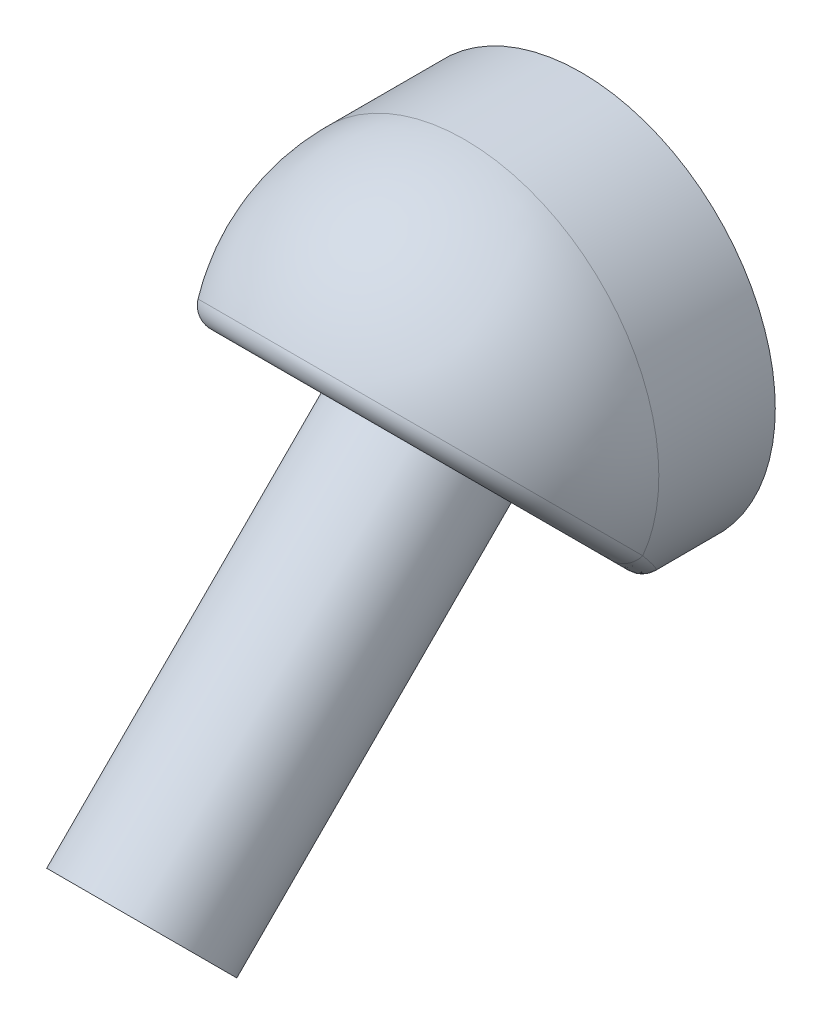
ISO-10303-21;
HEADER;
FILE_DESCRIPTION(('STEP AP214'),'2;1');
FILE_NAME('part.step','',(''),(''),'','','');
FILE_SCHEMA(('AUTOMOTIVE_DESIGN { 1 0 10303 214 1 1 1 1 }'));
ENDSEC;
DATA;
#1=APPLICATION_CONTEXT('core data for automotive mechanical design processes');
#2=APPLICATION_PROTOCOL_DEFINITION('international standard','automotive_design',2000,#1);
#3=PRODUCT_CONTEXT('',#1,'mechanical');
#4=PRODUCT('Part','Part','',(#3));
#5=PRODUCT_RELATED_PRODUCT_CATEGORY('part','',(#4));
#6=PRODUCT_DEFINITION_FORMATION('','',#4);
#7=PRODUCT_DEFINITION_CONTEXT('part definition',#1,'design');
#8=PRODUCT_DEFINITION('design','',#6,#7);
#9=PRODUCT_DEFINITION_SHAPE('','',#8);
#10=(LENGTH_UNIT() NAMED_UNIT(*) SI_UNIT(.MILLI.,.METRE.));
#11=(NAMED_UNIT(*) PLANE_ANGLE_UNIT() SI_UNIT($,.RADIAN.));
#12=(NAMED_UNIT(*) SI_UNIT($,.STERADIAN.) SOLID_ANGLE_UNIT());
#13=UNCERTAINTY_MEASURE_WITH_UNIT(LENGTH_MEASURE(1.E-05),#10,'distance_accuracy_value','');
#14=(GEOMETRIC_REPRESENTATION_CONTEXT(3) GLOBAL_UNCERTAINTY_ASSIGNED_CONTEXT((#13)) GLOBAL_UNIT_ASSIGNED_CONTEXT((#10,
#11,#12)) REPRESENTATION_CONTEXT('',''));
#15=CARTESIAN_POINT('',(0.,0.,0.));
#16=DIRECTION('',(0.,0.,1.));
#17=DIRECTION('',(1.,0.,0.));
#18=AXIS2_PLACEMENT_3D('',#15,#16,#17);
#19=CARTESIAN_POINT('',(0.,-0.549999999999999,0.549999999999997));
#20=DIRECTION('',(0.,-0.707106781186549,0.707106781186546));
#21=DIRECTION('',(0.,-0.707106781186546,-0.707106781186549));
#22=AXIS2_PLACEMENT_3D('',#19,#20,#21);
#23=PLANE('',#22);
#24=CARTESIAN_POINT('',(-3.5,-0.25,0.849999999999999));
#25=DIRECTION('',(0.,-0.707106781186549,0.707106781186546));
#26=DIRECTION('',(0.,-0.707106781186546,-0.707106781186549));
#27=AXIS2_PLACEMENT_3D('',#24,#25,#26);
#28=CIRCLE('',#27,0.4);
#29=CARTESIAN_POINT('',(-3.5,-0.532842712474618,0.567157287525379));
#30=VERTEX_POINT('',#29);
#31=EDGE_CURVE('E89',#30,#30,#28,.T.);
#32=ORIENTED_EDGE('',*,*,#31,.F.);
#33=EDGE_LOOP('',(#32));
#34=FACE_BOUND('',#33,.T.);
#35=CARTESIAN_POINT('',(-3.5,-0.249999999999999,0.849999999999998));
#36=DIRECTION('',(0.,-0.707106781186549,0.707106781186546));
#37=DIRECTION('',(0.,-0.707106781186546,-0.707106781186549));
#38=AXIS2_PLACEMENT_3D('',#35,#36,#37);
#39=CIRCLE('',#38,0.863545411729259);
#40=CARTESIAN_POINT('',(-2.67451750095032,-0.429289321881342,0.670710678118655));
#41=VERTEX_POINT('',#40);
#42=CARTESIAN_POINT('',(-4.32548249904969,-0.429289321881342,0.670710678118655));
#43=VERTEX_POINT('',#42);
#44=EDGE_CURVE('E77',#41,#43,#39,.T.);
#45=ORIENTED_EDGE('',*,*,#44,.T.);
#46=CARTESIAN_POINT('',(-3.5,-0.0707106781186549,1.02928932188134));
#47=DIRECTION('',(0.,-0.707106781186549,0.707106781186546));
#48=DIRECTION('',(0.,-0.707106781186546,-0.707106781186549));
#49=AXIS2_PLACEMENT_3D('',#46,#47,#48);
#50=ELLIPSE('',#49,1.27279220613579,0.9);
#51=EDGE_CURVE('E72',#43,#41,#50,.T.);
#52=ORIENTED_EDGE('',*,*,#51,.T.);
#53=EDGE_LOOP('',(#45,#52));
#54=FACE_BOUND('',#53,.T.);
#55=ADVANCED_FACE('F39',(#34,#54),#23,.T.);
#56=CARTESIAN_POINT('',(-3.5,0.,0.));
#57=DIRECTION('',(0.,0.,1.));
#58=DIRECTION('',(1.,0.,0.));
#59=AXIS2_PLACEMENT_3D('',#56,#57,#58);
#60=PLANE('',#59);
#61=CARTESIAN_POINT('',(-3.5,0.,0.));
#62=DIRECTION('',(0.,0.,1.));
#63=DIRECTION('',(1.,0.,0.));
#64=AXIS2_PLACEMENT_3D('',#61,#62,#63);
#65=CIRCLE('',#64,1.);
#66=CARTESIAN_POINT('',(-2.5,0.,0.));
#67=VERTEX_POINT('',#66);
#68=EDGE_CURVE('E79',#67,#67,#65,.T.);
#69=ORIENTED_EDGE('',*,*,#68,.F.);
#70=EDGE_LOOP('',(#69));
#71=FACE_BOUND('',#70,.T.);
#72=ADVANCED_FACE('F104',(#71),#60,.F.);
#73=CARTESIAN_POINT('',(-3.5,0.,1.6));
#74=DIRECTION('',(0.,0.,-1.));
#75=DIRECTION('',(-1.,0.,0.));
#76=AXIS2_PLACEMENT_3D('',#73,#74,#75);
#77=CYLINDRICAL_SURFACE('',#76,1.);
#78=ORIENTED_EDGE('',*,*,#68,.T.);
#79=EDGE_LOOP('',(#78));
#80=FACE_BOUND('',#79,.T.);
#81=CARTESIAN_POINT('',(-3.5,0.,0.6));
#82=DIRECTION('',(0.,0.,-1.));
#83=DIRECTION('',(-1.,0.,0.));
#84=AXIS2_PLACEMENT_3D('',#81,#82,#83);
#85=CIRCLE('',#84,1.);
#86=CARTESIAN_POINT('',(-4.41720277672187,-0.398420715291875,0.6));
#87=VERTEX_POINT('',#86);
#88=CARTESIAN_POINT('',(-2.58279722327813,-0.398420715291875,0.6));
#89=VERTEX_POINT('',#88);
#90=EDGE_CURVE('E84',#87,#89,#85,.T.);
#91=ORIENTED_EDGE('',*,*,#90,.T.);
#92=CARTESIAN_POINT('',(-3.5,0.,0.958578643762689));
#93=DIRECTION('',(0.,0.668964731622451,-0.743294146247165));
#94=DIRECTION('',(0.,-0.743294146247165,-0.668964731622451));
#95=AXIS2_PLACEMENT_3D('',#92,#93,#94);
#96=ELLIPSE('',#95,1.34536240470737,1.);
#97=EDGE_CURVE('E48',#89,#87,#96,.T.);
#98=ORIENTED_EDGE('',*,*,#97,.T.);
#99=EDGE_LOOP('',(#91,#98));
#100=FACE_BOUND('',#99,.T.);
#101=ADVANCED_FACE('F110',(#80,#100),#77,.T.);
#102=CARTESIAN_POINT('',(-3.5,0.,0.6));
#103=DIRECTION('',(0.,0.,1.));
#104=DIRECTION('',(1.,0.,0.));
#105=AXIS2_PLACEMENT_3D('',#102,#103,#104);
#106=SPHERICAL_SURFACE('',#105,1.);
#107=ORIENTED_EDGE('',*,*,#90,.F.);
#108=CARTESIAN_POINT('',(-3.5,-0.199210357645938,0.799210357645938));
#109=DIRECTION('',(0.,0.707106781186549,-0.707106781186546));
#110=DIRECTION('',(0.,0.707106781186546,0.707106781186549));
#111=AXIS2_PLACEMENT_3D('',#108,#109,#110);
#112=CIRCLE('',#111,0.959494901921399);
#113=EDGE_CURVE('E12',#87,#89,#112,.T.);
#114=ORIENTED_EDGE('',*,*,#113,.T.);
#115=EDGE_LOOP('',(#107,#114));
#116=FACE_BOUND('',#115,.T.);
#117=ADVANCED_FACE('F106',(#116),#106,.T.);
#118=CARTESIAN_POINT('',(-3.5,-0.179289321881344,0.779289321881344));
#119=DIRECTION('',(0.,-0.707106781186549,0.707106781186546));
#120=DIRECTION('',(0.,-0.707106781186546,-0.707106781186549));
#121=AXIS2_PLACEMENT_3D('',#118,#119,#120);
#122=TOROIDAL_SURFACE('',#121,0.863545411729259,0.1);
#123=CARTESIAN_POINT('',(-2.67451750095032,-0.358578643762687,0.6));
#124=DIRECTION('',(-0.293619058302362,-0.675939290395828,-0.675939290395831));
#125=DIRECTION('',(0.,0.707106781186549,-0.707106781186546));
#126=AXIS2_PLACEMENT_3D('',#123,#124,#125);
#127=CIRCLE('',#126,0.1);
#128=EDGE_CURVE('E68',#89,#41,#127,.T.);
#129=ORIENTED_EDGE('',*,*,#128,.F.);
#130=ORIENTED_EDGE('',*,*,#113,.F.);
#131=CARTESIAN_POINT('',(-4.32548249904969,-0.358578643762687,0.6));
#132=DIRECTION('',(0.293619058302364,-0.675939290395827,-0.67593929039583));
#133=DIRECTION('',(0.,0.707106781186549,-0.707106781186546));
#134=AXIS2_PLACEMENT_3D('',#131,#132,#133);
#135=CIRCLE('',#134,0.1);
#136=EDGE_CURVE('E61',#43,#87,#135,.T.);
#137=ORIENTED_EDGE('',*,*,#136,.F.);
#138=ORIENTED_EDGE('',*,*,#44,.F.);
#139=EDGE_LOOP('',(#129,#130,#137,#138));
#140=FACE_BOUND('',#139,.T.);
#141=ADVANCED_FACE('F41',(#140),#122,.T.);
#142=CARTESIAN_POINT('',(-3.5,-1.,0.0585786437626852));
#143=CARTESIAN_POINT('',(-3.5,-1.,0.0784698805006509));
#144=CARTESIAN_POINT('',(-3.5,-0.992387953251129,0.0968469869991941));
#145=CARTESIAN_POINT('',(-3.5,-0.984775906502258,0.115224093497737));
#146=CARTESIAN_POINT('',(-3.5,-0.970710678118655,0.12928932188134));
#147=CARTESIAN_POINT('',(-3.45624438111667,-1.,0.0585786437626852));
#148=CARTESIAN_POINT('',(-3.45711484885714,-1.,0.078469880500651));
#149=CARTESIAN_POINT('',(-3.45825187512204,-0.992387953251129,0.0968469869991941));
#150=CARTESIAN_POINT('',(-3.45938919972581,-0.984775906502258,0.115224093497737));
#151=CARTESIAN_POINT('',(-3.460619943005,-0.970710678118655,0.12928932188134));
#152=CARTESIAN_POINT('',(-3.41248876223333,-0.997106996490958,0.061182346920823));
#153=CARTESIAN_POINT('',(-3.41421737035475,-0.997220690274455,0.0810926720286004));
#154=CARTESIAN_POINT('',(-3.41650375024408,-0.989683168057124,0.0994735578263763));
#155=CARTESIAN_POINT('',(-3.41876672585545,-0.982142552216969,0.117857447783026));
#156=CARTESIAN_POINT('',(-3.42123988601,-0.968106974960517,0.131893025039478));
#157=CARTESIAN_POINT('',(-3.32574135225439,-0.985688280311782,0.0714591914820815));
#158=CARTESIAN_POINT('',(-3.32916432096607,-0.986254770517604,0.0914395080765319));
#159=CARTESIAN_POINT('',(-3.33371116117972,-0.979005791767407,0.109841390897386));
#160=CARTESIAN_POINT('',(-3.33823426909843,-0.971753828954111,0.128246171045884));
#161=CARTESIAN_POINT('',(-3.34316721702895,-0.957830130399259,0.142169869600736));
#162=CARTESIAN_POINT('',(-3.28277447620086,-0.977069417454149,0.0792161680539514));
#163=CARTESIAN_POINT('',(-3.2870099446427,-0.977972504158043,0.0992537950978051));
#164=CARTESIAN_POINT('',(-3.29269004988406,-0.970946084800989,0.1176672367826));
#165=CARTESIAN_POINT('',(-3.29832559166828,-0.963907850226154,0.136092149773841));
#166=CARTESIAN_POINT('',(-3.30449702858077,-0.950073153827389,0.149926846172606));
#167=CARTESIAN_POINT('',(-3.19829986523165,-0.954437274298872,0.0995850968937009));
#168=CARTESIAN_POINT('',(-3.20409171411777,-0.95622844844438,0.119764240847236));
#169=CARTESIAN_POINT('',(-3.21199146867578,-0.949777111460397,0.138219412020277));
#170=CARTESIAN_POINT('',(-3.21984398167525,-0.943313511288894,0.156686488711101));
#171=CARTESIAN_POINT('',(-3.22846987870848,-0.92970422498764,0.170295775012356));
#172=CARTESIAN_POINT('',(-3.15687847345882,-0.940265263726409,0.112339906408917));
#173=CARTESIAN_POINT('',(-3.16339320014235,-0.942602777197628,0.132614859842123));
#174=CARTESIAN_POINT('',(-3.17239490192383,-0.936519254407039,0.151089941362299));
#175=CARTESIAN_POINT('',(-3.18133353396695,-0.930410041345438,0.169589958654557));
#176=CARTESIAN_POINT('',(-3.19119062611294,-0.916949415472423,0.183050584527572));
#177=CARTESIAN_POINT('',(-3.07613316177111,-0.906822209185883,0.142438655495391));
#178=CARTESIAN_POINT('',(-3.08397985359748,-0.910448827942115,0.162929585495262));
#179=CARTESIAN_POINT('',(-3.09513314943466,-0.905222810615845,0.181466802130957));
#180=CARTESIAN_POINT('',(-3.1062178820271,-0.899969169041611,0.200030830958384));
#181=CARTESIAN_POINT('',(-3.118519845594,-0.88685066638595,0.213149333614045));
#182=CARTESIAN_POINT('',(-3.03696479284298,-0.887365981548891,0.159949260368684));
#183=CARTESIAN_POINT('',(-3.04540379113836,-0.891727505249907,0.180575315109206));
#184=CARTESIAN_POINT('',(-3.05761364172274,-0.887010550659183,0.199141517382007));
#185=CARTESIAN_POINT('',(-3.06974520096309,-0.882249333482397,0.217750666517598));
#186=CARTESIAN_POINT('',(-3.08326831355868,-0.869340061512657,0.230659938487338));
#187=CARTESIAN_POINT('',(-2.96132725939277,-0.843698790679939,0.199249732150741));
#188=CARTESIAN_POINT('',(-2.97079503050801,-0.849700557612386,0.22017044454163));
#189=CARTESIAN_POINT('',(-2.9850612681912,-0.846117193787148,0.23881902713522));
#190=CARTESIAN_POINT('',(-2.99924136464509,-0.842485418449627,0.257514581550368));
#191=CARTESIAN_POINT('',(-3.01519453345349,-0.8300395897306,0.269960410269395));
#192=CARTESIAN_POINT('',(-2.92506643044743,-0.819309672868608,0.221199938180939));
#193=CARTESIAN_POINT('',(-2.93495915560705,-0.826206380710467,0.242296721263015));
#194=CARTESIAN_POINT('',(-2.95022339644376,-0.823268496441266,0.260984065989139));
#195=CARTESIAN_POINT('',(-2.96539809933025,-0.820263597208858,0.279736402791137));
#196=CARTESIAN_POINT('',(-2.98255978740269,-0.808089383700402,0.291910616299594));
#197=CARTESIAN_POINT('',(-2.85581865531852,-0.766175412812366,0.269020772231557));
#198=CARTESIAN_POINT('',(-2.86636814490662,-0.774999298461008,0.290496416265212));
#199=CARTESIAN_POINT('',(-2.88356664863234,-0.773462453336033,0.309286515838281));
#200=CARTESIAN_POINT('',(-2.90066642858618,-0.771851959278155,0.328148040721841));
#201=CARTESIAN_POINT('',(-2.92023678978667,-0.760268549649784,0.339731450350212));
#202=CARTESIAN_POINT('',(-2.82306610602808,-0.737279282125703,0.295027289849553));
#203=CARTESIAN_POINT('',(-2.83384169763846,-0.747122845403432,0.316722555558721));
#204=CARTESIAN_POINT('',(-2.85196702178599,-0.74636234952269,0.335561785536935));
#205=CARTESIAN_POINT('',(-2.86999627812758,-0.745508570677649,0.354491429322347));
#206=CARTESIAN_POINT('',(-2.89075949542527,-0.734262032031788,0.365737967968208));
#207=CARTESIAN_POINT('',(-2.76137770385608,-0.675591669693058,0.350546141038934));
#208=CARTESIAN_POINT('',(-2.77238140267591,-0.687572161698548,0.372711433510337));
#209=CARTESIAN_POINT('',(-2.7922923136293,-0.688469146310474,0.391674222646245));
#210=CARTESIAN_POINT('',(-2.8120978269066,-0.689263966867341,0.410736033132655));
#211=CARTESIAN_POINT('',(-2.83523993347047,-0.678743180842407,0.421256819157589));
#212=CARTESIAN_POINT('',(-2.73267653753418,-0.64268406927161,0.380162981418238));
#213=CARTESIAN_POINT('',(-2.7436824639373,-0.655767525161431,0.402595104587134));
#214=CARTESIAN_POINT('',(-2.76443663595018,-0.657565376379881,0.421617860236695));
#215=CARTESIAN_POINT('',(-2.78509364725055,-0.659241017313273,0.440758982686723));
#216=CARTESIAN_POINT('',(-2.80940888378076,-0.649126340463104,0.450873659536892));
#217=CARTESIAN_POINT('',(-2.67958875661853,-0.573499046336214,0.442429502060094));
#218=CARTESIAN_POINT('',(-2.69035192378892,-0.588840519020997,0.465431448884624));
#219=CARTESIAN_POINT('',(-2.71271695113748,-0.592538830415844,0.484599239867409));
#220=CARTESIAN_POINT('',(-2.73497641938301,-0.596104477111551,0.503895522888445));
#221=CARTESIAN_POINT('',(-2.76162988095667,-0.586859819821248,0.513140180178749));
#222=CARTESIAN_POINT('',(-2.65541730864327,-0.537139864517492,0.475152765696944));
#223=CARTESIAN_POINT('',(-2.66594154639727,-0.553620755569143,0.498473517182293));
#224=CARTESIAN_POINT('',(-2.68905403996105,-0.558337125877177,0.517712475136032));
#225=CARTESIAN_POINT('',(-2.71207433215643,-0.562900753633881,0.537099246366115));
#226=CARTESIAN_POINT('',(-2.73987557777895,-0.554136556184397,0.545863443815599));
#227=CARTESIAN_POINT('',(-2.61182692186565,-0.461639105709858,0.543103448623815));
#228=CARTESIAN_POINT('',(-2.62161213570378,-0.480400724338746,0.567104404846984));
#229=CARTESIAN_POINT('',(-2.6461353313863,-0.487244511281089,0.586510696303726));
#230=CARTESIAN_POINT('',(-2.67055964256674,-0.493924517532797,0.6060754824672));
#231=CARTESIAN_POINT('',(-2.70064422967908,-0.486185873257527,0.61381412674247));
#232=CARTESIAN_POINT('',(-2.59259035515877,-0.422445352635279,0.578377826390936));
#233=CARTESIAN_POINT('',(-2.6018872280589,-0.442331599739255,0.602755493733425));
#234=CARTESIAN_POINT('',(-2.62705000102217,-0.450302156946177,0.62224444146092));
#235=CARTESIAN_POINT('',(-2.65213202178222,-0.458089069828584,0.641910930171413));
#236=CARTESIAN_POINT('',(-2.68333131964289,-0.450911495490406,0.649088504509591));
#237=CARTESIAN_POINT('',(-2.55923460687762,-0.341917262202759,0.650853107780204));
#238=CARTESIAN_POINT('',(-2.56729007264254,-0.364000949358599,0.67603421137746));
#239=CARTESIAN_POINT('',(-2.59363874860689,-0.374307152889213,0.695713653079161));
#240=CARTESIAN_POINT('',(-2.61990210545917,-0.384419265130241,0.715580734869756));
#241=CARTESIAN_POINT('',(-2.65331114618986,-0.378436214101138,0.721563785898859));
#242=CARTESIAN_POINT('',(-2.54525694382192,-0.300553862500126,0.688080167512575));
#243=CARTESIAN_POINT('',(-2.55257673039633,-0.32369290794283,0.713703060206712));
#244=CARTESIAN_POINT('',(-2.57944520733335,-0.335224769661254,0.733476881801918));
#245=CARTESIAN_POINT('',(-2.60625107032555,-0.346543103664764,0.753456896335233));
#246=CARTESIAN_POINT('',(-2.64073124943973,-0.341209154368768,0.758790845631229));
#247=CARTESIAN_POINT('',(-2.52270063576641,-0.216372269878814,0.763843600871755));
#248=CARTESIAN_POINT('',(-2.52829238410401,-0.241514320252883,0.790408584075511));
#249=CARTESIAN_POINT('',(-2.5560982445859,-0.255568431648245,0.810396836427401));
#250=CARTESIAN_POINT('',(-2.5838390239727,-0.269400392117599,0.830599607882398));
#251=CARTESIAN_POINT('',(-2.62043057218977,-0.265445721009587,0.83455427899041));
#252=CARTESIAN_POINT('',(-2.51421816075158,-0.173541296780411,0.802391476660318));
#253=CARTESIAN_POINT('',(-2.51884062420415,-0.199613114429821,0.829471802101515));
#254=CARTESIAN_POINT('',(-2.5470349334441,-0.21498040547451,0.849566344549933));
#255=CARTESIAN_POINT('',(-2.57519136369705,-0.230106809691812,0.869893190308185));
#256=CARTESIAN_POINT('',(-2.61279634467642,-0.226897845221025,0.873102154778973));
#257=CARTESIAN_POINT('',(-2.50284356877177,-0.0871423294959111,0.880150547216368));
#258=CARTESIAN_POINT('',(-2.50529176712349,-0.114909346176437,0.908329848853964));
#259=CARTESIAN_POINT('',(-2.53415231245845,-0.132960690303081,0.928663299770339));
#260=CARTESIAN_POINT('',(-2.56297418188261,-0.150765515551012,0.949234484448986));
#261=CARTESIAN_POINT('',(-2.60255921189459,-0.149138774664975,0.950861225335023));
#262=CARTESIAN_POINT('',(-2.5,-0.0435711647479555,0.919364595489528));
#263=CARTESIAN_POINT('',(-2.50127210786066,-0.0720858483304803,0.948142588233404));
#264=CARTESIAN_POINT('',(-2.53037862426148,-0.091524751690396,0.968594365843261));
#265=CARTESIAN_POINT('',(-2.55947815663389,-0.110699518459266,0.989300481540732));
#266=CARTESIAN_POINT('',(-2.6,-0.109924726391815,0.990075273608183));
#267=CARTESIAN_POINT('',(-2.5,0.0435711647479554,0.997792692035849));
#268=CARTESIAN_POINT('',(-2.49871974902825,0.0137811568639928,1.02784763608408));
#269=CARTESIAN_POINT('',(-2.52820001950122,-0.00847524830960431,1.04856292168212));
#270=CARTESIAN_POINT('',(-2.55767337286305,-0.0304658582501998,1.0695341417498));
#271=CARTESIAN_POINT('',(-2.6,-0.0314966298454951,1.0685033701545));
#272=CARTESIAN_POINT('',(-2.50284356877177,0.0871423294959109,1.03700674030901));
#273=CARTESIAN_POINT('',(-2.50022183169342,0.0568414595327835,1.06775473404933));
#274=CARTESIAN_POINT('',(-2.52979510293793,0.0331383164585026,1.08860041144805));
#275=CARTESIAN_POINT('',(-2.5593976057482,0.00971683097288452,1.10971683097288));
#276=CARTESIAN_POINT('',(-2.60255921189459,0.00771741842766481,1.10771741842766));
#277=CARTESIAN_POINT('',(-2.51421816075158,0.173541296780411,1.11476581086506));
#278=CARTESIAN_POINT('',(-2.50876531948025,0.142491356183695,1.14699232395322));
#279=CARTESIAN_POINT('',(-2.53840008367893,0.115869695270183,1.1681255789211));
#280=CARTESIAN_POINT('',(-2.56806389592353,0.0895266989925009,1.1895266989925));
#281=CARTESIAN_POINT('',(-2.61279634467642,0.085476488983715,1.18547648898371));
#282=CARTESIAN_POINT('',(-2.52270063576641,0.216372269878814,1.15331368665362));
#283=CARTESIAN_POINT('',(-2.51579865860859,0.185098680135468,1.18633946695134));
#284=CARTESIAN_POINT('',(-2.54536384040628,0.156988716637643,1.20761503733616));
#285=CARTESIAN_POINT('',(-2.57499847744466,0.129170604637728,1.22917060463773));
#286=CARTESIAN_POINT('',(-2.62043057218977,0.124024364772277,1.22402436477228));
#287=CARTESIAN_POINT('',(-2.54525694382192,0.300553862500125,1.2290771200128));
#288=CARTESIAN_POINT('',(-2.53537963264508,0.26915244228357,1.26380793958181));
#289=CARTESIAN_POINT('',(-2.56467618636202,0.238060162122717,1.28539367689093));
#290=CARTESIAN_POINT('',(-2.59404044810873,0.207251831992183,1.30725183199218));
#291=CARTESIAN_POINT('',(-2.64073124943973,0.199787798131458,1.29978779813146));
#292=CARTESIAN_POINT('',(-2.55923460687762,0.341917262202759,1.26630417974517));
#293=CARTESIAN_POINT('',(-2.54787649771126,0.310622264768819,1.30195233629817));
#294=CARTESIAN_POINT('',(-2.57693249691271,0.278020585426311,1.32369188057837));
#295=CARTESIAN_POINT('',(-2.60610030846301,0.245712122137139,1.34571212213714));
#296=CARTESIAN_POINT('',(-2.65331114618986,0.237014857863828,1.33701485786383));
#297=CARTESIAN_POINT('',(-2.59259035515877,0.422445352635278,1.33877946113444));
#298=CARTESIAN_POINT('',(-2.57828662083331,0.391719612781544,1.37638289306753));
#299=CARTESIAN_POINT('',(-2.60672845795313,0.356114751292296,1.39845238124289));
#300=CARTESIAN_POINT('',(-2.63527744546474,0.320790570178678,1.42079057017868));
#301=CARTESIAN_POINT('',(-2.68333131964289,0.309490139253096,1.4094901392531));
#302=CARTESIAN_POINT('',(-2.61182692186565,0.461639105709858,1.37405383890156));
#303=CARTESIAN_POINT('',(-2.59610688452195,0.431380742188568,1.41270278872581));
#304=CARTESIAN_POINT('',(-2.62413051878263,0.394269242910338,1.43493666327536));
#305=CARTESIAN_POINT('',(-2.65230790792332,0.357442199213686,1.45744219921369));
#306=CARTESIAN_POINT('',(-2.70064422967908,0.344764517020217,1.44476451702022));
#307=CARTESIAN_POINT('',(-2.65541730864327,0.537139864517492,1.44200452182843));
#308=CARTESIAN_POINT('',(-2.63699855008439,0.508193677189974,1.48287635790082));
#309=CARTESIAN_POINT('',(-2.66405030973339,0.468107964137903,1.50545533167293));
#310=CARTESIAN_POINT('',(-2.69124708759148,0.428290430672569,1.52829043067257));
#311=CARTESIAN_POINT('',(-2.73987557777895,0.412715199947087,1.51271519994709));
#312=CARTESIAN_POINT('',(-2.67958875661853,0.573499046336214,1.47472778546528));
#313=CARTESIAN_POINT('',(-2.65993593575,0.545393893004658,1.51677847315887));
#314=CARTESIAN_POINT('',(-2.68638757681553,0.503832166008647,1.53953073421525));
#315=CARTESIAN_POINT('',(-2.71303115077115,0.46253509380738,1.56253509380738));
#316=CARTESIAN_POINT('',(-2.76162988095667,0.445438463583938,1.54543846358394));
#317=CARTESIAN_POINT('',(-2.73267653753418,0.64268406927161,1.53699430610714));
#318=CARTESIAN_POINT('',(-2.7108337789978,0.616634394800073,1.58153736910084));
#319=CARTESIAN_POINT('',(-2.73594807904359,0.572185568441301,1.60464288940789));
#320=CARTESIAN_POINT('',(-2.76124084136151,0.527982931225706,1.62798293122571));
#321=CARTESIAN_POINT('',(-2.80940888378076,0.507704984225794,1.60770498422579));
#322=CARTESIAN_POINT('',(-2.76137770385608,0.675591669693058,1.56661114648644));
#323=CARTESIAN_POINT('',(-2.7386220512684,0.650742517723912,1.61246105481116));
#324=CARTESIAN_POINT('',(-2.76295343498145,0.604880790845765,1.6357459029671));
#325=CARTESIAN_POINT('',(-2.78750689945467,0.559252623892372,1.65925262389237));
#326=CARTESIAN_POINT('',(-2.83523993347047,0.537321824605097,1.6373218246051));
#327=CARTESIAN_POINT('',(-2.82306610602808,0.737279282125703,1.62212999767582));
#328=CARTESIAN_POINT('',(-2.79893046319656,0.715162571986555,1.67071315556026));
#329=CARTESIAN_POINT('',(-2.82155750438884,0.666568796184221,1.69434945983011));
#330=CARTESIAN_POINT('',(-2.84438864907744,0.618190064520962,1.71819006452096));
#331=CARTESIAN_POINT('',(-2.89075949542527,0.592840675794478,1.69284067579448));
#332=CARTESIAN_POINT('',(-2.85581865531852,0.766175412812365,1.64813651529382));
#333=CARTESIAN_POINT('',(-2.83124637300118,0.74556596757949,1.6981299638816));
#334=CARTESIAN_POINT('',(-2.85291151797352,0.695659971001115,1.72194702588083));
#335=CARTESIAN_POINT('',(-2.8748156809886,0.645945999483736,1.74594599948374));
#336=CARTESIAN_POINT('',(-2.92023678978667,0.618847193412474,1.71884719341247));
#337=CARTESIAN_POINT('',(-2.92506643044743,0.819309672868607,1.69595734934444));
#338=CARTESIAN_POINT('',(-2.90024396006623,0.801949802791056,1.74884406095973));
#339=CARTESIAN_POINT('',(-2.91984508924192,0.749545627164407,1.7729973800164));
#340=CARTESIAN_POINT('',(-2.93966426967476,0.697317380141887,1.79731738014189));
#341=CARTESIAN_POINT('',(-2.98255978740269,0.666668027463092,1.76666802746309));
#342=CARTESIAN_POINT('',(-2.96132725939277,0.843698790679939,1.71790755537464));
#343=CARTESIAN_POINT('',(-2.93670097685832,0.828047633347236,1.77225225930504));
#344=CARTESIAN_POINT('',(-2.95517137157664,0.77447446281563,1.79658071167876));
#345=CARTESIAN_POINT('',(-2.97387877043967,0.721043951658782,1.82104395165878));
#346=CARTESIAN_POINT('',(-3.01519453345349,0.68861823349329,1.78861823349329));
#347=CARTESIAN_POINT('',(-3.03696479284298,0.887365981548891,1.75720802715669));
#348=CARTESIAN_POINT('',(-3.0135082749855,0.875201583835316,1.81444739465293));
#349=CARTESIAN_POINT('',(-3.02957487172091,0.819453548910184,1.83908006829397));
#350=CARTESIAN_POINT('',(-3.04585755780295,0.763836739210899,1.8638367392109));
#351=CARTESIAN_POINT('',(-3.08326831355868,0.727918705275347,1.82791870527535));
#352=CARTESIAN_POINT('',(-3.07613316177111,0.906822209185883,1.77471863202999));
#353=CARTESIAN_POINT('',(-3.05363236381259,0.89639818846106,1.8333641678885));
#354=CARTESIAN_POINT('',(-3.0684175298931,0.839670634856924,1.85815622218527));
#355=CARTESIAN_POINT('',(-3.08341358252251,0.783033639605447,1.88303363960545));
#356=CARTESIAN_POINT('',(-3.118519845594,0.74542931014864,1.84542931014864));
#357=CARTESIAN_POINT('',(-3.15687847345882,0.940265263726409,1.80481738111646));
#358=CARTESIAN_POINT('',(-3.13714024773208,0.933155166470924,1.86610557732245));
#359=CARTESIAN_POINT('',(-3.14921895104463,0.874672858150122,1.89115049890947));
#360=CARTESIAN_POINT('',(-3.16149189084743,0.816275458530881,1.91627545853088));
#361=CARTESIAN_POINT('',(-3.19119062611294,0.775528059235113,1.87552805923511));
#362=CARTESIAN_POINT('',(-3.19829986523165,0.954437274298872,1.81757219063168));
#363=CARTESIAN_POINT('',(-3.18032100805485,0.948866166472575,1.88006681635409));
#364=CARTESIAN_POINT('',(-3.19099481058281,0.889640525088479,1.90524213515303));
#365=CARTESIAN_POINT('',(-3.20182710708525,0.830458457377344,1.93045845737735));
#366=CARTESIAN_POINT('',(-3.22846987870848,0.78828286875033,1.88828286875033));
#367=CARTESIAN_POINT('',(-3.28277447620086,0.977069417454149,1.83794111947143));
#368=CARTESIAN_POINT('',(-3.26908762502462,0.974135720453479,1.90249435884444));
#369=CARTESIAN_POINT('',(-3.27681136907099,0.913671201590828,1.92785178845502));
#370=CARTESIAN_POINT('',(-3.2846850357975,0.853249451599585,1.95324945159959));
#371=CARTESIAN_POINT('',(-3.30449702858077,0.808651797590079,1.90865179759008));
#372=CARTESIAN_POINT('',(-3.32574135225439,0.985688280311782,1.8456980960433));
#373=CARTESIAN_POINT('',(-3.31451514063318,0.983828148670097,1.91108038145065));
#374=CARTESIAN_POINT('',(-3.32074639816914,0.922898012561164,1.93652445682713));
#375=CARTESIAN_POINT('',(-3.32706145222999,0.861978871185596,1.9619788711856));
#376=CARTESIAN_POINT('',(-3.34316721702895,0.816408774161949,1.91640877416195));
#377=CARTESIAN_POINT('',(-3.41248876223333,0.997106996490958,1.85597494060455));
#378=CARTESIAN_POINT('',(-3.40668751401354,0.99671985685737,1.92249560187287));
#379=CARTESIAN_POINT('',(-3.40980854107518,0.935146926108802,1.94803516512776));
#380=CARTESIAN_POINT('',(-3.41301339094878,0.873586045971873,1.97358604597187));
#381=CARTESIAN_POINT('',(-3.42123988601,0.826685618723207,1.92668561872321));
#382=CARTESIAN_POINT('',(-3.45624438111667,1.,1.85857864376269));
#383=CARTESIAN_POINT('',(-3.45332107531356,1.,1.92539650755462));
#384=CARTESIAN_POINT('',(-3.45490427053759,0.938268343236509,1.95096659701382));
#385=CARTESIAN_POINT('',(-3.4564855514275,0.876536686473018,1.97653668647302));
#386=CARTESIAN_POINT('',(-3.460619943005,0.829289321881345,1.92928932188135));
#387=CARTESIAN_POINT('',(-3.54375561888334,1.,1.85857864376269));
#388=CARTESIAN_POINT('',(-3.54667892468644,1.,1.92539650755462));
#389=CARTESIAN_POINT('',(-3.54509572946241,0.938268343236509,1.95096659701382));
#390=CARTESIAN_POINT('',(-3.54351444857251,0.876536686473018,1.97653668647302));
#391=CARTESIAN_POINT('',(-3.539380056995,0.829289321881345,1.92928932188135));
#392=CARTESIAN_POINT('',(-3.58751123776667,0.997106996490958,1.85597494060455));
#393=CARTESIAN_POINT('',(-3.59331248598646,0.99671985685737,1.92249560187287));
#394=CARTESIAN_POINT('',(-3.59019145892482,0.935146926108802,1.94803516512776));
#395=CARTESIAN_POINT('',(-3.58698660905122,0.873586045971873,1.97358604597187));
#396=CARTESIAN_POINT('',(-3.57876011399,0.826685618723207,1.92668561872321));
#397=CARTESIAN_POINT('',(-3.67425864774561,0.985688280311782,1.8456980960433));
#398=CARTESIAN_POINT('',(-3.68548485936682,0.983828148670097,1.91108038145065));
#399=CARTESIAN_POINT('',(-3.67925360183086,0.922898012561164,1.93652445682713));
#400=CARTESIAN_POINT('',(-3.67293854777001,0.861978871185596,1.9619788711856));
#401=CARTESIAN_POINT('',(-3.65683278297105,0.816408774161949,1.91640877416195));
#402=CARTESIAN_POINT('',(-3.71722552379914,0.977069417454149,1.83794111947143));
#403=CARTESIAN_POINT('',(-3.73091237497538,0.974135720453479,1.90249435884444));
#404=CARTESIAN_POINT('',(-3.72318863092901,0.913671201590828,1.92785178845502));
#405=CARTESIAN_POINT('',(-3.7153149642025,0.853249451599585,1.95324945159959));
#406=CARTESIAN_POINT('',(-3.69550297141923,0.808651797590079,1.90865179759008));
#407=CARTESIAN_POINT('',(-3.80170013476836,0.954437274298872,1.81757219063168));
#408=CARTESIAN_POINT('',(-3.81967899194516,0.948866166472575,1.88006681635409));
#409=CARTESIAN_POINT('',(-3.80900518941719,0.889640525088479,1.90524213515303));
#410=CARTESIAN_POINT('',(-3.79817289291475,0.830458457377344,1.93045845737735));
#411=CARTESIAN_POINT('',(-3.77153012129152,0.78828286875033,1.88828286875033));
#412=CARTESIAN_POINT('',(-3.84312152654119,0.940265263726409,1.80481738111646));
#413=CARTESIAN_POINT('',(-3.86285975226793,0.933155166470924,1.86610557732245));
#414=CARTESIAN_POINT('',(-3.85078104895537,0.874672858150122,1.89115049890947));
#415=CARTESIAN_POINT('',(-3.83850810915257,0.816275458530881,1.91627545853088));
#416=CARTESIAN_POINT('',(-3.80880937388707,0.775528059235113,1.87552805923511));
#417=CARTESIAN_POINT('',(-3.92386683822889,0.906822209185883,1.77471863202999));
#418=CARTESIAN_POINT('',(-3.94636763618741,0.89639818846106,1.8333641678885));
#419=CARTESIAN_POINT('',(-3.9315824701069,0.839670634856924,1.85815622218527));
#420=CARTESIAN_POINT('',(-3.91658641747749,0.783033639605447,1.88303363960545));
#421=CARTESIAN_POINT('',(-3.881480154406,0.74542931014864,1.84542931014864));
#422=CARTESIAN_POINT('',(-3.96303520715703,0.887365981548892,1.75720802715669));
#423=CARTESIAN_POINT('',(-3.9864917250145,0.875201583835317,1.81444739465293));
#424=CARTESIAN_POINT('',(-3.9704251282791,0.819453548910184,1.83908006829397));
#425=CARTESIAN_POINT('',(-3.95414244219706,0.7638367392109,1.8638367392109));
#426=CARTESIAN_POINT('',(-3.91673168644132,0.727918705275347,1.82791870527535));
#427=CARTESIAN_POINT('',(-4.03867274060723,0.843698790679939,1.71790755537464));
#428=CARTESIAN_POINT('',(-4.06329902314168,0.828047633347236,1.77225225930504));
#429=CARTESIAN_POINT('',(-4.04482862842336,0.774474462815631,1.79658071167876));
#430=CARTESIAN_POINT('',(-4.02612122956033,0.721043951658783,1.82104395165878));
#431=CARTESIAN_POINT('',(-3.98480546654651,0.68861823349329,1.78861823349329));
#432=CARTESIAN_POINT('',(-4.07493356955257,0.819309672868608,1.69595734934444));
#433=CARTESIAN_POINT('',(-4.09975603993377,0.801949802791056,1.74884406095973));
#434=CARTESIAN_POINT('',(-4.08015491075809,0.749545627164407,1.7729973800164));
#435=CARTESIAN_POINT('',(-4.06033573032524,0.697317380141888,1.79731738014189));
#436=CARTESIAN_POINT('',(-4.01744021259732,0.666668027463092,1.76666802746309));
#437=CARTESIAN_POINT('',(-4.14418134468148,0.766175412812366,1.64813651529382));
#438=CARTESIAN_POINT('',(-4.16875362699882,0.74556596757949,1.6981299638816));
#439=CARTESIAN_POINT('',(-4.14708848202648,0.695659971001115,1.72194702588083));
#440=CARTESIAN_POINT('',(-4.1251843190114,0.645945999483736,1.74594599948374));
#441=CARTESIAN_POINT('',(-4.07976321021333,0.618847193412474,1.71884719341247));
#442=CARTESIAN_POINT('',(-4.17693389397193,0.737279282125704,1.62212999767582));
#443=CARTESIAN_POINT('',(-4.20106953680344,0.715162571986556,1.67071315556026));
#444=CARTESIAN_POINT('',(-4.17844249561117,0.666568796184222,1.69434945983011));
#445=CARTESIAN_POINT('',(-4.15561135092257,0.618190064520962,1.71819006452096));
#446=CARTESIAN_POINT('',(-4.10924050457473,0.592840675794478,1.69284067579448));
#447=CARTESIAN_POINT('',(-4.23862229614392,0.675591669693059,1.56661114648644));
#448=CARTESIAN_POINT('',(-4.26137794873161,0.650742517723913,1.61246105481116));
#449=CARTESIAN_POINT('',(-4.23704656501856,0.604880790845765,1.6357459029671));
#450=CARTESIAN_POINT('',(-4.21249310054533,0.559252623892373,1.65925262389237));
#451=CARTESIAN_POINT('',(-4.16476006652953,0.537321824605098,1.6373218246051));
#452=CARTESIAN_POINT('',(-4.26732346246582,0.64268406927161,1.53699430610714));
#453=CARTESIAN_POINT('',(-4.2891662210022,0.616634394800073,1.58153736910084));
#454=CARTESIAN_POINT('',(-4.26405192095642,0.572185568441301,1.60464288940789));
#455=CARTESIAN_POINT('',(-4.2387591586385,0.527982931225706,1.62798293122571));
#456=CARTESIAN_POINT('',(-4.19059111621924,0.507704984225794,1.60770498422579));
#457=CARTESIAN_POINT('',(-4.32041124338148,0.573499046336214,1.47472778546528));
#458=CARTESIAN_POINT('',(-4.34006406425,0.545393893004658,1.51677847315887));
#459=CARTESIAN_POINT('',(-4.31361242318447,0.503832166008648,1.53953073421525));
#460=CARTESIAN_POINT('',(-4.28696884922885,0.462535093807381,1.56253509380738));
#461=CARTESIAN_POINT('',(-4.23837011904333,0.445438463583938,1.54543846358394));
#462=CARTESIAN_POINT('',(-4.34458269135673,0.537139864517492,1.44200452182843));
#463=CARTESIAN_POINT('',(-4.36300144991561,0.508193677189975,1.48287635790082));
#464=CARTESIAN_POINT('',(-4.33594969026661,0.468107964137904,1.50545533167293));
#465=CARTESIAN_POINT('',(-4.30875291240852,0.428290430672569,1.52829043067257));
#466=CARTESIAN_POINT('',(-4.26012442222106,0.412715199947088,1.51271519994709));
#467=CARTESIAN_POINT('',(-4.38817307813436,0.461639105709858,1.37405383890156));
#468=CARTESIAN_POINT('',(-4.40389311547805,0.431380742188568,1.41270278872581));
#469=CARTESIAN_POINT('',(-4.37586948121738,0.394269242910338,1.43493666327536));
#470=CARTESIAN_POINT('',(-4.34769209207668,0.357442199213687,1.45744219921369));
#471=CARTESIAN_POINT('',(-4.29935577032092,0.344764517020217,1.44476451702022));
#472=CARTESIAN_POINT('',(-4.40740964484123,0.422445352635278,1.33877946113444));
#473=CARTESIAN_POINT('',(-4.4217133791667,0.391719612781544,1.37638289306753));
#474=CARTESIAN_POINT('',(-4.39327154204687,0.356114751292296,1.39845238124289));
#475=CARTESIAN_POINT('',(-4.36472255453526,0.320790570178679,1.42079057017868));
#476=CARTESIAN_POINT('',(-4.31666868035711,0.309490139253096,1.4094901392531));
#477=CARTESIAN_POINT('',(-4.44076539312239,0.341917262202759,1.26630417974517));
#478=CARTESIAN_POINT('',(-4.45212350228874,0.310622264768819,1.30195233629817));
#479=CARTESIAN_POINT('',(-4.42306750308729,0.278020585426311,1.32369188057837));
#480=CARTESIAN_POINT('',(-4.39389969153699,0.245712122137139,1.34571212213714));
#481=CARTESIAN_POINT('',(-4.34668885381015,0.237014857863828,1.33701485786383));
#482=CARTESIAN_POINT('',(-4.45474305617809,0.300553862500125,1.2290771200128));
#483=CARTESIAN_POINT('',(-4.46462036735492,0.26915244228357,1.26380793958181));
#484=CARTESIAN_POINT('',(-4.43532381363798,0.238060162122717,1.28539367689093));
#485=CARTESIAN_POINT('',(-4.40595955189127,0.207251831992183,1.30725183199218));
#486=CARTESIAN_POINT('',(-4.35926875056028,0.199787798131458,1.29978779813146));
#487=CARTESIAN_POINT('',(-4.47729936423359,0.216372269878814,1.15331368665362));
#488=CARTESIAN_POINT('',(-4.48420134139141,0.185098680135468,1.18633946695134));
#489=CARTESIAN_POINT('',(-4.45463615959372,0.156988716637643,1.20761503733616));
#490=CARTESIAN_POINT('',(-4.42500152255534,0.129170604637728,1.22917060463773));
#491=CARTESIAN_POINT('',(-4.37956942781023,0.124024364772277,1.22402436477228));
#492=CARTESIAN_POINT('',(-4.48578183924842,0.173541296780411,1.11476581086506));
#493=CARTESIAN_POINT('',(-4.49123468051976,0.142491356183695,1.14699232395322));
#494=CARTESIAN_POINT('',(-4.46159991632107,0.115869695270183,1.1681255789211));
#495=CARTESIAN_POINT('',(-4.43193610407647,0.089526698992501,1.1895266989925));
#496=CARTESIAN_POINT('',(-4.38720365532358,0.085476488983715,1.18547648898371));
#497=CARTESIAN_POINT('',(-4.49715643122823,0.0871423294959111,1.03700674030901));
#498=CARTESIAN_POINT('',(-4.49977816830659,0.0568414595327837,1.06775473404933));
#499=CARTESIAN_POINT('',(-4.47020489706207,0.0331383164585028,1.08860041144805));
#500=CARTESIAN_POINT('',(-4.4406023942518,0.00971683097288468,1.10971683097288));
#501=CARTESIAN_POINT('',(-4.39744078810541,0.00771741842766496,1.10771741842766));
#502=CARTESIAN_POINT('',(-4.5,0.0435711647479556,0.997792692035849));
#503=CARTESIAN_POINT('',(-4.50128025097176,0.0137811568639931,1.02784763608408));
#504=CARTESIAN_POINT('',(-4.47179998049879,-0.00847524830960408,1.04856292168212));
#505=CARTESIAN_POINT('',(-4.44232662713695,-0.0304658582501996,1.0695341417498));
#506=CARTESIAN_POINT('',(-4.4,-0.0314966298454949,1.0685033701545));
#507=CARTESIAN_POINT('',(-4.5,-0.0435711647479553,0.919364595489529));
#508=CARTESIAN_POINT('',(-4.49872789213934,-0.07208584833048,0.948142588233404));
#509=CARTESIAN_POINT('',(-4.46962137573853,-0.0915247516903957,0.968594365843261));
#510=CARTESIAN_POINT('',(-4.44052184336611,-0.110699518459266,0.989300481540732));
#511=CARTESIAN_POINT('',(-4.4,-0.109924726391815,0.990075273608183));
#512=CARTESIAN_POINT('',(-4.49715643122823,-0.0871423294959107,0.880150547216369));
#513=CARTESIAN_POINT('',(-4.49470823287652,-0.114909346176437,0.908329848853964));
#514=CARTESIAN_POINT('',(-4.46584768754155,-0.132960690303081,0.928663299770339));
#515=CARTESIAN_POINT('',(-4.43702581811739,-0.150765515551012,0.949234484448987));
#516=CARTESIAN_POINT('',(-4.39744078810541,-0.149138774664974,0.950861225335023));
#517=CARTESIAN_POINT('',(-4.48578183924842,-0.173541296780411,0.802391476660318));
#518=CARTESIAN_POINT('',(-4.48115937579586,-0.19961311442982,0.829471802101515));
#519=CARTESIAN_POINT('',(-4.4529650665559,-0.214980405474509,0.849566344549933));
#520=CARTESIAN_POINT('',(-4.42480863630295,-0.230106809691812,0.869893190308186));
#521=CARTESIAN_POINT('',(-4.38720365532358,-0.226897845221025,0.873102154778973));
#522=CARTESIAN_POINT('',(-4.47729936423359,-0.216372269878813,0.763843600871756));
#523=CARTESIAN_POINT('',(-4.471707615896,-0.241514320252883,0.790408584075511));
#524=CARTESIAN_POINT('',(-4.4439017554141,-0.255568431648244,0.810396836427401));
#525=CARTESIAN_POINT('',(-4.4161609760273,-0.269400392117599,0.830599607882399));
#526=CARTESIAN_POINT('',(-4.37956942781023,-0.265445721009587,0.834554278990411));
#527=CARTESIAN_POINT('',(-4.45474305617809,-0.300553862500125,0.688080167512575));
#528=CARTESIAN_POINT('',(-4.44742326960367,-0.323692907942829,0.713703060206713));
#529=CARTESIAN_POINT('',(-4.42055479266665,-0.335224769661254,0.733476881801918));
#530=CARTESIAN_POINT('',(-4.39374892967445,-0.346543103664763,0.753456896335234));
#531=CARTESIAN_POINT('',(-4.35926875056028,-0.341209154368768,0.75879084563123));
#532=CARTESIAN_POINT('',(-4.44076539312239,-0.341917262202758,0.650853107780205));
#533=CARTESIAN_POINT('',(-4.43270992735746,-0.364000949358598,0.676034211377461));
#534=CARTESIAN_POINT('',(-4.40636125139311,-0.374307152889213,0.695713653079161));
#535=CARTESIAN_POINT('',(-4.38009789454083,-0.384419265130241,0.715580734869756));
#536=CARTESIAN_POINT('',(-4.34668885381015,-0.378436214101138,0.721563785898859));
#537=CARTESIAN_POINT('',(-4.40740964484123,-0.422445352635278,0.578377826390937));
#538=CARTESIAN_POINT('',(-4.39811277194111,-0.442331599739254,0.602755493733425));
#539=CARTESIAN_POINT('',(-4.37294999897783,-0.450302156946177,0.62224444146092));
#540=CARTESIAN_POINT('',(-4.34786797821778,-0.458089069828583,0.641910930171413));
#541=CARTESIAN_POINT('',(-4.31666868035711,-0.450911495490405,0.649088504509591));
#542=CARTESIAN_POINT('',(-4.38817307813436,-0.461639105709858,0.543103448623815));
#543=CARTESIAN_POINT('',(-4.37838786429622,-0.480400724338746,0.567104404846984));
#544=CARTESIAN_POINT('',(-4.35386466861371,-0.487244511281089,0.586510696303726));
#545=CARTESIAN_POINT('',(-4.32944035743326,-0.493924517532796,0.6060754824672));
#546=CARTESIAN_POINT('',(-4.29935577032092,-0.486185873257527,0.61381412674247));
#547=CARTESIAN_POINT('',(-4.34458269135673,-0.537139864517492,0.475152765696944));
#548=CARTESIAN_POINT('',(-4.33405845360274,-0.553620755569143,0.498473517182294));
#549=CARTESIAN_POINT('',(-4.31094596003896,-0.558337125877177,0.517712475136032));
#550=CARTESIAN_POINT('',(-4.28792566784357,-0.562900753633881,0.537099246366115));
#551=CARTESIAN_POINT('',(-4.26012442222106,-0.554136556184397,0.545863443815599));
#552=CARTESIAN_POINT('',(-4.32041124338148,-0.573499046336214,0.442429502060095));
#553=CARTESIAN_POINT('',(-4.30964807621108,-0.588840519020996,0.465431448884624));
#554=CARTESIAN_POINT('',(-4.28728304886252,-0.592538830415843,0.484599239867409));
#555=CARTESIAN_POINT('',(-4.26502358061699,-0.596104477111551,0.503895522888446));
#556=CARTESIAN_POINT('',(-4.23837011904333,-0.586859819821247,0.513140180178749));
#557=CARTESIAN_POINT('',(-4.26732346246582,-0.642684069271609,0.380162981418238));
#558=CARTESIAN_POINT('',(-4.2563175360627,-0.65576752516143,0.402595104587135));
#559=CARTESIAN_POINT('',(-4.23556336404982,-0.65756537637988,0.421617860236696));
#560=CARTESIAN_POINT('',(-4.21490635274946,-0.659241017313272,0.440758982686724));
#561=CARTESIAN_POINT('',(-4.19059111621924,-0.649126340463103,0.450873659536893));
#562=CARTESIAN_POINT('',(-4.23862229614392,-0.675591669693058,0.350546141038934));
#563=CARTESIAN_POINT('',(-4.22761859732409,-0.687572161698548,0.372711433510337));
#564=CARTESIAN_POINT('',(-4.2077076863707,-0.688469146310474,0.391674222646245));
#565=CARTESIAN_POINT('',(-4.1879021730934,-0.68926396686734,0.410736033132656));
#566=CARTESIAN_POINT('',(-4.16476006652953,-0.678743180842407,0.421256819157589));
#567=CARTESIAN_POINT('',(-4.17693389397193,-0.737279282125703,0.295027289849553));
#568=CARTESIAN_POINT('',(-4.16615830236154,-0.747122845403432,0.316722555558722));
#569=CARTESIAN_POINT('',(-4.14803297821402,-0.746362349522689,0.335561785536935));
#570=CARTESIAN_POINT('',(-4.13000372187242,-0.745508570677649,0.354491429322347));
#571=CARTESIAN_POINT('',(-4.10924050457474,-0.734262032031788,0.365737967968208));
#572=CARTESIAN_POINT('',(-4.14418134468148,-0.766175412812366,0.269020772231557));
#573=CARTESIAN_POINT('',(-4.13363185509338,-0.774999298461008,0.290496416265212));
#574=CARTESIAN_POINT('',(-4.11643335136766,-0.773462453336033,0.309286515838281));
#575=CARTESIAN_POINT('',(-4.09933357141382,-0.771851959278154,0.328148040721841));
#576=CARTESIAN_POINT('',(-4.07976321021333,-0.760268549649784,0.339731450350212));
#577=CARTESIAN_POINT('',(-4.07493356955257,-0.819309672868608,0.22119993818094));
#578=CARTESIAN_POINT('',(-4.06504084439295,-0.826206380710466,0.242296721263015));
#579=CARTESIAN_POINT('',(-4.04977660355624,-0.823268496441266,0.26098406598914));
#580=CARTESIAN_POINT('',(-4.03460190066976,-0.820263597208858,0.279736402791138));
#581=CARTESIAN_POINT('',(-4.01744021259732,-0.808089383700401,0.291910616299594));
#582=CARTESIAN_POINT('',(-4.03867274060723,-0.843698790679939,0.199249732150741));
#583=CARTESIAN_POINT('',(-4.029204969492,-0.849700557612385,0.220170444541631));
#584=CARTESIAN_POINT('',(-4.0149387318088,-0.846117193787148,0.238819027135221));
#585=CARTESIAN_POINT('',(-4.00075863535491,-0.842485418449627,0.257514581550368));
#586=CARTESIAN_POINT('',(-3.98480546654651,-0.8300395897306,0.269960410269396));
#587=CARTESIAN_POINT('',(-3.96303520715703,-0.887365981548891,0.159949260368684));
#588=CARTESIAN_POINT('',(-3.95459620886164,-0.891727505249906,0.180575315109206));
#589=CARTESIAN_POINT('',(-3.94238635827726,-0.887010550659183,0.199141517382007));
#590=CARTESIAN_POINT('',(-3.93025479903692,-0.882249333482397,0.217750666517598));
#591=CARTESIAN_POINT('',(-3.91673168644132,-0.869340061512657,0.230659938487338));
#592=CARTESIAN_POINT('',(-3.92386683822889,-0.906822209185883,0.142438655495391));
#593=CARTESIAN_POINT('',(-3.91602014640253,-0.910448827942115,0.162929585495262));
#594=CARTESIAN_POINT('',(-3.90486685056535,-0.905222810615845,0.181466802130957));
#595=CARTESIAN_POINT('',(-3.89378211797291,-0.899969169041611,0.200030830958384));
#596=CARTESIAN_POINT('',(-3.881480154406,-0.88685066638595,0.213149333614045));
#597=CARTESIAN_POINT('',(-3.84312152654119,-0.940265263726409,0.112339906408917));
#598=CARTESIAN_POINT('',(-3.83660679985765,-0.942602777197628,0.132614859842123));
#599=CARTESIAN_POINT('',(-3.82760509807617,-0.936519254407039,0.151089941362299));
#600=CARTESIAN_POINT('',(-3.81866646603306,-0.930410041345438,0.169589958654557));
#601=CARTESIAN_POINT('',(-3.80880937388707,-0.916949415472423,0.183050584527572));
#602=CARTESIAN_POINT('',(-3.80170013476836,-0.954437274298872,0.099585096893701));
#603=CARTESIAN_POINT('',(-3.79590828588223,-0.95622844844438,0.119764240847236));
#604=CARTESIAN_POINT('',(-3.78800853132422,-0.949777111460397,0.138219412020277));
#605=CARTESIAN_POINT('',(-3.78015601832475,-0.943313511288894,0.156686488711101));
#606=CARTESIAN_POINT('',(-3.77153012129152,-0.929704224987639,0.170295775012356));
#607=CARTESIAN_POINT('',(-3.71722552379914,-0.977069417454149,0.0792161680539516));
#608=CARTESIAN_POINT('',(-3.7129900553573,-0.977972504158043,0.0992537950978052));
#609=CARTESIAN_POINT('',(-3.70730995011594,-0.970946084800989,0.1176672367826));
#610=CARTESIAN_POINT('',(-3.70167440833172,-0.963907850226154,0.136092149773841));
#611=CARTESIAN_POINT('',(-3.69550297141923,-0.950073153827389,0.149926846172606));
#612=CARTESIAN_POINT('',(-3.67425864774561,-0.985688280311782,0.0714591914820816));
#613=CARTESIAN_POINT('',(-3.67083567903394,-0.986254770517604,0.091439508076532));
#614=CARTESIAN_POINT('',(-3.66628883882028,-0.979005791767407,0.109841390897386));
#615=CARTESIAN_POINT('',(-3.66176573090158,-0.971753828954111,0.128246171045884));
#616=CARTESIAN_POINT('',(-3.65683278297105,-0.957830130399259,0.142169869600736));
#617=CARTESIAN_POINT('',(-3.58751123776667,-0.997106996490958,0.061182346920823));
#618=CARTESIAN_POINT('',(-3.58578262964525,-0.997220690274455,0.0810926720286004));
#619=CARTESIAN_POINT('',(-3.58349624975593,-0.989683168057124,0.0994735578263762));
#620=CARTESIAN_POINT('',(-3.58123327414455,-0.982142552216969,0.117857447783025));
#621=CARTESIAN_POINT('',(-3.57876011399,-0.968106974960517,0.131893025039478));
#622=CARTESIAN_POINT('',(-3.54375561888334,-1.,0.0585786437626852));
#623=CARTESIAN_POINT('',(-3.54288515114286,-1.,0.0784698805006509));
#624=CARTESIAN_POINT('',(-3.54174812487796,-0.992387953251129,0.0968469869991941));
#625=CARTESIAN_POINT('',(-3.5406108002742,-0.984775906502258,0.115224093497737));
#626=CARTESIAN_POINT('',(-3.539380056995,-0.970710678118655,0.12928932188134));
#627=CARTESIAN_POINT('',(-3.5,-1.,0.0585786437626852));
#628=CARTESIAN_POINT('',(-3.5,-1.,0.0784698805006509));
#629=CARTESIAN_POINT('',(-3.5,-0.992387953251129,0.0968469869991941));
#630=CARTESIAN_POINT('',(-3.5,-0.984775906502258,0.115224093497737));
#631=CARTESIAN_POINT('',(-3.5,-0.970710678118655,0.12928932188134));
#632=(BOUNDED_SURFACE() B_SPLINE_SURFACE(3,2,((#142,#143,#144,#145,#146),(#147,#148,#149,#150,
#151),(#152,#153,#154,#155,#156),(#157,#158,#159,#160,#161),(#162,#163,#164,#165,#166),(#167,
#168,#169,#170,#171),(#172,#173,#174,#175,#176),(#177,#178,#179,#180,#181),(#182,#183,#184,#185,
#186),(#187,#188,#189,#190,#191),(#192,#193,#194,#195,#196),(#197,#198,#199,#200,#201),(#202,
#203,#204,#205,#206),(#207,#208,#209,#210,#211),(#212,#213,#214,#215,#216),(#217,#218,#219,#220,
#221),(#222,#223,#224,#225,#226),(#227,#228,#229,#230,#231),(#232,#233,#234,#235,#236),(#237,
#238,#239,#240,#241),(#242,#243,#244,#245,#246),(#247,#248,#249,#250,#251),(#252,#253,#254,#255,
#256),(#257,#258,#259,#260,#261),(#262,#263,#264,#265,#266),(#267,#268,#269,#270,#271),(#272,
#273,#274,#275,#276),(#277,#278,#279,#280,#281),(#282,#283,#284,#285,#286),(#287,#288,#289,#290,
#291),(#292,#293,#294,#295,#296),(#297,#298,#299,#300,#301),(#302,#303,#304,#305,#306),(#307,
#308,#309,#310,#311),(#312,#313,#314,#315,#316),(#317,#318,#319,#320,#321),(#322,#323,#324,#325,
#326),(#327,#328,#329,#330,#331),(#332,#333,#334,#335,#336),(#337,#338,#339,#340,#341),(#342,
#343,#344,#345,#346),(#347,#348,#349,#350,#351),(#352,#353,#354,#355,#356),(#357,#358,#359,#360,
#361),(#362,#363,#364,#365,#366),(#367,#368,#369,#370,#371),(#372,#373,#374,#375,#376),(#377,
#378,#379,#380,#381),(#382,#383,#384,#385,#386),(#387,#388,#389,#390,#391),(#392,#393,#394,#395,
#396),(#397,#398,#399,#400,#401),(#402,#403,#404,#405,#406),(#407,#408,#409,#410,#411),(#412,
#413,#414,#415,#416),(#417,#418,#419,#420,#421),(#422,#423,#424,#425,#426),(#427,#428,#429,#430,
#431),(#432,#433,#434,#435,#436),(#437,#438,#439,#440,#441),(#442,#443,#444,#445,#446),(#447,
#448,#449,#450,#451),(#452,#453,#454,#455,#456),(#457,#458,#459,#460,#461),(#462,#463,#464,#465,
#466),(#467,#468,#469,#470,#471),(#472,#473,#474,#475,#476),(#477,#478,#479,#480,#481),(#482,
#483,#484,#485,#486),(#487,#488,#489,#490,#491),(#492,#493,#494,#495,#496),(#497,#498,#499,#500,
#501),(#502,#503,#504,#505,#506),(#507,#508,#509,#510,#511),(#512,#513,#514,#515,#516),(#517,
#518,#519,#520,#521),(#522,#523,#524,#525,#526),(#527,#528,#529,#530,#531),(#532,#533,#534,#535,
#536),(#537,#538,#539,#540,#541),(#542,#543,#544,#545,#546),(#547,#548,#549,#550,#551),(#552,
#553,#554,#555,#556),(#557,#558,#559,#560,#561),(#562,#563,#564,#565,#566),(#567,#568,#569,#570,
#571),(#572,#573,#574,#575,#576),(#577,#578,#579,#580,#581),(#582,#583,#584,#585,#586),(#587,
#588,#589,#590,#591),(#592,#593,#594,#595,#596),(#597,#598,#599,#600,#601),(#602,#603,#604,#605,
#606),(#607,#608,#609,#610,#611),(#612,#613,#614,#615,#616),(#617,#618,#619,#620,#621),(#622,
#623,#624,#625,#626),(#627,#628,#629,#630,#631)),.UNSPECIFIED.,.T.,.F.,
.F.) B_SPLINE_SURFACE_WITH_KNOTS((4,2,2,2,2,2,2,2,2,2,2,2,2,2,2,2,2,2,2,2,2,2,2,2,2,2,2,2,2,2,2,
2,2,2,2,2,2,2,2,2,2,2,2,2,2,2,2,2,4),(3,2,3),(0.,0.117977153703278,0.237922198233132,
0.361580259591823,0.490306619538528,0.624980744419438,0.765993100012556,0.913280198203,
1.06638426023547,1.22452185215514,1.3866534579089,1.55155088061772,1.71786192934076,
1.88417297806379,2.04907040077261,2.21120200652637,2.36933959844604,2.52244366047851,
2.66973075866896,2.81074311426207,2.94541723914298,3.07414359908969,3.19780166044838,
3.31774670497823,3.43572385868151,3.55370101238479,3.67364605691465,3.79730411827334,
3.92603047822004,4.06070460310095,4.20171695869407,4.34900405688451,4.50210811891698,
4.66024571083666,4.82237731659041,4.98727473929924,5.15358578802227,5.3198968367453,
5.48479425945413,5.64692586520788,5.80506345712756,5.95816751916003,6.10545461735047,
6.24646697294359,6.3811410978245,6.5098674577712,6.63352551912989,6.75347056365975,
6.87144771736303),(0.,0.5,1.),
.UNSPECIFIED.) GEOMETRIC_REPRESENTATION_ITEM() RATIONAL_B_SPLINE_SURFACE(((1.,0.980785280403231,
1.,0.980785280403231,1.),(1.,0.980785280403231,1.,0.980785280403231,1.),(1.,0.980644337034805,
1.,0.980644337034805,1.),(1.,0.980086176240485,1.,0.980086176240485,1.),(1.,0.979664389703475,
1.,0.979664389703475,1.),(1.,0.978550774265016,1.,0.978550774265016,1.),(1.,0.977850990123182,
1.,0.977850990123182,1.),(1.,0.976187170470984,1.,0.976187170470984,1.),(1.,0.9752134798055,1.,
0.9752134798055,1.),(1.,0.97300707574065,1.,0.97300707574065,1.),(1.,0.971764472978005,1.,
0.971764472978005,1.),(1.,0.96902546832016,1.,0.96902546832016,1.),(1.,0.967519874086138,1.,
0.967519874086138,1.),(1.,0.964260846838015,1.,0.964260846838015,1.),(1.,0.962499366699218,1.,
0.962499366699218,1.),(1.,0.958735914202009,1.,0.958735914202009,1.),(1.,0.95672719135344,1.,
0.95672719135344,1.),(1.,0.952478508040775,1.,0.952478508040775,1.),(1.,0.950233116447217,1.,
0.950233116447217,1.),(1.,0.94552272892521,1.,0.94552272892521,1.),(1.,0.943053618866614,1.,
0.943053618866614,1.),(1.,0.937910325403228,1.,0.937910325403228,1.),(1.,0.935233362176308,1.,
0.935233362176308,1.),(1.,0.929692453320838,1.,0.929692453320838,1.),(1.,0.926827101473002,1.,
0.926827101473002,1.),(1.,0.920931963549572,1.,0.920931963549572,1.),(1.,0.917902177473977,1.,
0.917902177473977,1.),(1.,0.911706406316179,1.,0.911706406316179,1.),(1.,0.908541797807373,1.,
0.908541797807373,1.),(1.,0.902111973667195,1.,0.902111973667195,1.),(1.,0.898849335820145,1.,
0.898849335820145,1.),(1.,0.892268617365835,1.,0.892268617365835,1.),(1.,0.888953882500111,1.,
0.888953882500111,1.),(1.,0.882326531652331,1.,0.882326531652331,1.),(1.,0.879017206559846,1.,
0.879017206559846,1.),(1.,0.872473977917515,1.,0.872473977917515,1.),(1.,0.869241985875415,1.,
0.869241985875415,1.),(1.,0.862945854908944,1.,0.862945854908944,1.),(1.,0.859880430959553,1.,
0.859880430959553,1.),(1.,0.854031159511883,1.,0.854031159511883,1.),(1.,0.85124084886057,1.,
0.85124084886057,1.),(1.,0.846075175322193,1.,0.846075175322193,1.),(1.,0.843686929047179,1.,
0.843686929047179,1.),(1.,0.83946897568357,1.,0.83946897568357,1.),(1.,0.837620979697815,1.,
0.837620979697815,1.),(1.,0.834616554483356,1.,0.834616554483356,1.),(1.,0.833441026070578,1.,
0.833441026070578,1.),(1.,0.831873826989508,1.,0.831873826989508,1.),(1.,0.831469612302545,1.,
0.831469612302545,1.),(1.,0.831469612302545,1.,0.831469612302545,1.),(1.,0.831873826989508,1.,
0.831873826989508,1.),(1.,0.833441026070578,1.,0.833441026070578,1.),(1.,0.834616554483356,1.,
0.834616554483356,1.),(1.,0.837620979697815,1.,0.837620979697815,1.),(1.,0.83946897568357,1.,
0.83946897568357,1.),(1.,0.843686929047179,1.,0.843686929047179,1.),(1.,0.846075175322192,1.,
0.846075175322192,1.),(1.,0.85124084886057,1.,0.85124084886057,1.),(1.,0.854031159511884,1.,
0.854031159511884,1.),(1.,0.859880430959553,1.,0.859880430959553,1.),(1.,0.862945854908944,1.,
0.862945854908944,1.),(1.,0.869241985875415,1.,0.869241985875415,1.),(1.,0.872473977917515,1.,
0.872473977917515,1.),(1.,0.879017206559846,1.,0.879017206559846,1.),(1.,0.882326531652331,1.,
0.882326531652331,1.),(1.,0.888953882500111,1.,0.888953882500111,1.),(1.,0.892268617365835,1.,
0.892268617365835,1.),(1.,0.898849335820145,1.,0.898849335820145,1.),(1.,0.902111973667195,1.,
0.902111973667195,1.),(1.,0.908541797807373,1.,0.908541797807373,1.),(1.,0.911706406316179,1.,
0.911706406316179,1.),(1.,0.917902177473977,1.,0.917902177473977,1.),(1.,0.920931963549572,1.,
0.920931963549572,1.),(1.,0.926827101473002,1.,0.926827101473002,1.),(1.,0.929692453320838,1.,
0.929692453320838,1.),(1.,0.935233362176308,1.,0.935233362176308,1.),(1.,0.937910325403228,1.,
0.937910325403228,1.),(1.,0.943053618866614,1.,0.943053618866614,1.),(1.,0.94552272892521,1.,
0.94552272892521,1.),(1.,0.950233116447217,1.,0.950233116447217,1.),(1.,0.952478508040775,1.,
0.952478508040775,1.),(1.,0.95672719135344,1.,0.95672719135344,1.),(1.,0.958735914202009,1.,
0.958735914202009,1.),(1.,0.962499366699218,1.,0.962499366699218,1.),(1.,0.964260846838015,1.,
0.964260846838015,1.),(1.,0.967519874086138,1.,0.967519874086138,1.),(1.,0.96902546832016,1.,
0.96902546832016,1.),(1.,0.971764472978005,1.,0.971764472978005,1.),(1.,0.97300707574065,1.,
0.97300707574065,1.),(1.,0.9752134798055,1.,0.9752134798055,1.),(1.,0.976187170470984,1.,
0.976187170470984,1.),(1.,0.977850990123182,1.,0.977850990123182,1.),(1.,0.978550774265016,1.,
0.978550774265016,1.),(1.,0.979664389703475,1.,0.979664389703475,1.),(1.,0.980086176240485,1.,
0.980086176240485,1.),(1.,0.980644337034805,1.,0.980644337034805,1.),(1.,0.980785280403231,1.,
0.980785280403231,1.),(1.,0.980785280403231,1.,0.980785280403231,1.))) REPRESENTATION_ITEM('') SURFACE());
#633=ORIENTED_EDGE('',*,*,#136,.T.);
#634=ORIENTED_EDGE('',*,*,#97,.F.);
#635=ORIENTED_EDGE('',*,*,#128,.T.);
#636=ORIENTED_EDGE('',*,*,#51,.F.);
#637=EDGE_LOOP('',(#633,#634,#635,#636));
#638=FACE_BOUND('',#637,.T.);
#639=ADVANCED_FACE('F70',(#638),#632,.T.);
#640=CARTESIAN_POINT('',(-3.5,-1.6642135623731,2.26421356237309));
#641=DIRECTION('',(0.,0.707106781186549,-0.707106781186546));
#642=DIRECTION('',(0.,0.707106781186546,0.707106781186549));
#643=AXIS2_PLACEMENT_3D('',#640,#641,#642);
#644=CYLINDRICAL_SURFACE('',#643,0.4);
#645=CARTESIAN_POINT('',(-3.5,-1.6642135623731,2.26421356237309));
#646=DIRECTION('',(0.,-0.707106781186549,0.707106781186546));
#647=DIRECTION('',(0.,-0.707106781186546,-0.707106781186549));
#648=AXIS2_PLACEMENT_3D('',#645,#646,#647);
#649=CIRCLE('',#648,0.4);
#650=CARTESIAN_POINT('',(-3.5,-1.94705627484772,1.98137084989847));
#651=VERTEX_POINT('',#650);
#652=EDGE_CURVE('E75',#651,#651,#649,.T.);
#653=ORIENTED_EDGE('',*,*,#652,.F.);
#654=EDGE_LOOP('',(#653));
#655=FACE_BOUND('',#654,.T.);
#656=ORIENTED_EDGE('',*,*,#31,.T.);
#657=EDGE_LOOP('',(#656));
#658=FACE_BOUND('',#657,.T.);
#659=ADVANCED_FACE('F97',(#655,#658),#644,.T.);
#660=CARTESIAN_POINT('',(0.,-1.9642135623731,1.96421356237309));
#661=DIRECTION('',(0.,-0.707106781186549,0.707106781186546));
#662=DIRECTION('',(0.,-0.707106781186546,-0.707106781186549));
#663=AXIS2_PLACEMENT_3D('',#660,#661,#662);
#664=PLANE('',#663);
#665=ORIENTED_EDGE('',*,*,#652,.T.);
#666=EDGE_LOOP('',(#665));
#667=FACE_BOUND('',#666,.T.);
#668=ADVANCED_FACE('F95',(#667),#664,.T.);
#669=CLOSED_SHELL('',(#55,#72,#101,#117,#141,#639,#659,#668));
#670=MANIFOLD_SOLID_BREP('B2',#669);
#671=ADVANCED_BREP_SHAPE_REPRESENTATION('',(#18,#670),#14);
#672=SHAPE_DEFINITION_REPRESENTATION(#9,#671);
ENDSEC;
END-ISO-10303-21;
